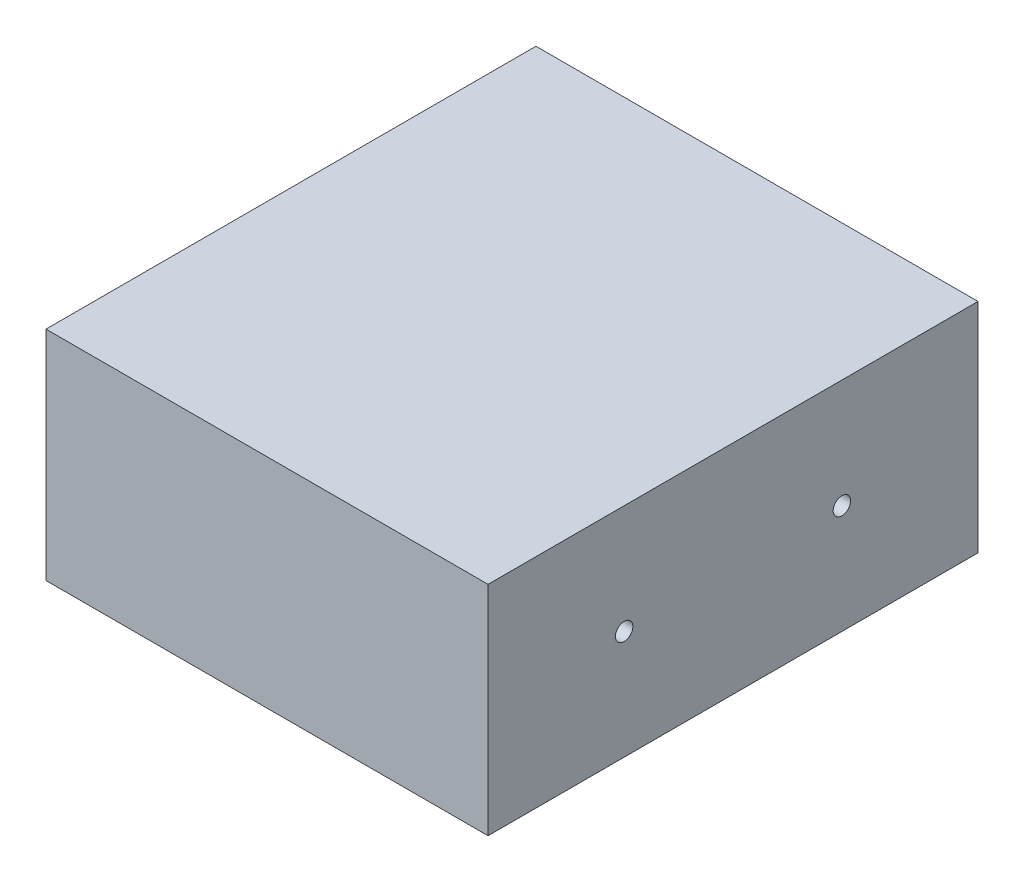
ISO-10303-21;
HEADER;
FILE_DESCRIPTION(('STEP AP214'),'2;1');
FILE_NAME('part.step','',(''),(''),'','','');
FILE_SCHEMA(('AUTOMOTIVE_DESIGN { 1 0 10303 214 1 1 1 1 }'));
ENDSEC;
DATA;
#1=APPLICATION_CONTEXT('core data for automotive mechanical design processes');
#2=APPLICATION_PROTOCOL_DEFINITION('international standard','automotive_design',2000,#1);
#3=PRODUCT_CONTEXT('',#1,'mechanical');
#4=PRODUCT('Part','Part','',(#3));
#5=PRODUCT_RELATED_PRODUCT_CATEGORY('part','',(#4));
#6=PRODUCT_DEFINITION_FORMATION('','',#4);
#7=PRODUCT_DEFINITION_CONTEXT('part definition',#1,'design');
#8=PRODUCT_DEFINITION('design','',#6,#7);
#9=PRODUCT_DEFINITION_SHAPE('','',#8);
#10=(LENGTH_UNIT() NAMED_UNIT(*) SI_UNIT(.MILLI.,.METRE.));
#11=(NAMED_UNIT(*) PLANE_ANGLE_UNIT() SI_UNIT($,.RADIAN.));
#12=(NAMED_UNIT(*) SI_UNIT($,.STERADIAN.) SOLID_ANGLE_UNIT());
#13=UNCERTAINTY_MEASURE_WITH_UNIT(LENGTH_MEASURE(1.E-05),#10,'distance_accuracy_value','');
#14=(GEOMETRIC_REPRESENTATION_CONTEXT(3) GLOBAL_UNCERTAINTY_ASSIGNED_CONTEXT((#13)) GLOBAL_UNIT_ASSIGNED_CONTEXT((#10,
#11,#12)) REPRESENTATION_CONTEXT('',''));
#15=CARTESIAN_POINT('',(0.,0.,0.));
#16=DIRECTION('',(0.,0.,1.));
#17=DIRECTION('',(1.,0.,0.));
#18=AXIS2_PLACEMENT_3D('',#15,#16,#17);
#19=CARTESIAN_POINT('',(20.3,20.,22.5));
#20=DIRECTION('',(-1.,0.,0.));
#21=DIRECTION('',(0.,0.,1.));
#22=AXIS2_PLACEMENT_3D('',#19,#20,#21);
#23=PLANE('',#22);
#24=CARTESIAN_POINT('',(20.3,10.,10.));
#25=DIRECTION('',(1.,0.,0.));
#26=DIRECTION('',(0.,0.,-1.));
#27=AXIS2_PLACEMENT_3D('',#24,#25,#26);
#28=CIRCLE('',#27,0.79999999999999);
#29=CARTESIAN_POINT('',(20.3,10.,9.20000000000001));
#30=VERTEX_POINT('',#29);
#31=EDGE_CURVE('E115',#30,#30,#28,.T.);
#32=ORIENTED_EDGE('',*,*,#31,.F.);
#33=EDGE_LOOP('',(#32));
#34=FACE_BOUND('',#33,.T.);
#35=CARTESIAN_POINT('',(20.3,10.,-10.));
#36=DIRECTION('',(1.,0.,0.));
#37=DIRECTION('',(0.,0.,-1.));
#38=AXIS2_PLACEMENT_3D('',#35,#36,#37);
#39=CIRCLE('',#38,0.79999999999999);
#40=CARTESIAN_POINT('',(20.3,10.,-10.8));
#41=VERTEX_POINT('',#40);
#42=EDGE_CURVE('E121',#41,#41,#39,.T.);
#43=ORIENTED_EDGE('',*,*,#42,.F.);
#44=EDGE_LOOP('',(#43));
#45=FACE_BOUND('',#44,.T.);
#46=DIRECTION('',(0.,0.,-1.));
#47=VECTOR('',#46,1.);
#48=CARTESIAN_POINT('',(20.3,0.,22.5));
#49=LINE('',#48,#47);
#50=CARTESIAN_POINT('',(20.3,0.,22.5));
#51=VERTEX_POINT('',#50);
#52=CARTESIAN_POINT('',(20.3,0.,-22.5));
#53=VERTEX_POINT('',#52);
#54=EDGE_CURVE('E127',#51,#53,#49,.T.);
#55=ORIENTED_EDGE('',*,*,#54,.T.);
#56=DIRECTION('',(0.,-1.,0.));
#57=VECTOR('',#56,1.);
#58=CARTESIAN_POINT('',(20.3,20.,-22.5));
#59=LINE('',#58,#57);
#60=CARTESIAN_POINT('',(20.3,20.,-22.5));
#61=VERTEX_POINT('',#60);
#62=EDGE_CURVE('E11',#61,#53,#59,.T.);
#63=ORIENTED_EDGE('',*,*,#62,.F.);
#64=DIRECTION('',(0.,0.,-1.));
#65=VECTOR('',#64,1.);
#66=CARTESIAN_POINT('',(20.3,20.,22.5));
#67=LINE('',#66,#65);
#68=CARTESIAN_POINT('',(20.3,20.,22.5));
#69=VERTEX_POINT('',#68);
#70=EDGE_CURVE('E128',#69,#61,#67,.T.);
#71=ORIENTED_EDGE('',*,*,#70,.F.);
#72=DIRECTION('',(0.,-1.,0.));
#73=VECTOR('',#72,1.);
#74=CARTESIAN_POINT('',(20.3,20.,22.5));
#75=LINE('',#74,#73);
#76=EDGE_CURVE('E134',#69,#51,#75,.T.);
#77=ORIENTED_EDGE('',*,*,#76,.T.);
#78=EDGE_LOOP('',(#55,#63,#71,#77));
#79=FACE_BOUND('',#78,.T.);
#80=ADVANCED_FACE('F34',(#34,#45,#79),#23,.F.);
#81=CARTESIAN_POINT('',(-20.3,20.,-22.5));
#82=DIRECTION('',(0.,0.,1.));
#83=DIRECTION('',(1.,0.,0.));
#84=AXIS2_PLACEMENT_3D('',#81,#82,#83);
#85=PLANE('',#84);
#86=DIRECTION('',(-1.,0.,0.));
#87=VECTOR('',#86,1.);
#88=CARTESIAN_POINT('',(-20.3,0.,-22.5));
#89=LINE('',#88,#87);
#90=CARTESIAN_POINT('',(-20.3,0.,-22.5));
#91=VERTEX_POINT('',#90);
#92=EDGE_CURVE('E137',#53,#91,#89,.T.);
#93=ORIENTED_EDGE('',*,*,#92,.T.);
#94=DIRECTION('',(0.,-1.,0.));
#95=VECTOR('',#94,1.);
#96=CARTESIAN_POINT('',(-20.3,20.,-22.5));
#97=LINE('',#96,#95);
#98=CARTESIAN_POINT('',(-20.3,20.,-22.5));
#99=VERTEX_POINT('',#98);
#100=EDGE_CURVE('E42',#99,#91,#97,.T.);
#101=ORIENTED_EDGE('',*,*,#100,.F.);
#102=DIRECTION('',(-1.,0.,0.));
#103=VECTOR('',#102,1.);
#104=CARTESIAN_POINT('',(-20.3,20.,-22.5));
#105=LINE('',#104,#103);
#106=EDGE_CURVE('E81',#61,#99,#105,.T.);
#107=ORIENTED_EDGE('',*,*,#106,.F.);
#108=ORIENTED_EDGE('',*,*,#62,.T.);
#109=EDGE_LOOP('',(#93,#101,#107,#108));
#110=FACE_BOUND('',#109,.T.);
#111=ADVANCED_FACE('F160',(#110),#85,.F.);
#112=CARTESIAN_POINT('',(-20.3,20.,22.5));
#113=DIRECTION('',(1.,0.,0.));
#114=DIRECTION('',(0.,0.,-1.));
#115=AXIS2_PLACEMENT_3D('',#112,#113,#114);
#116=PLANE('',#115);
#117=CARTESIAN_POINT('',(-20.3,10.,10.));
#118=DIRECTION('',(-1.,0.,0.));
#119=DIRECTION('',(0.,0.,1.));
#120=AXIS2_PLACEMENT_3D('',#117,#118,#119);
#121=CIRCLE('',#120,0.79999999999999);
#122=CARTESIAN_POINT('',(-20.3,10.,10.8));
#123=VERTEX_POINT('',#122);
#124=EDGE_CURVE('E105',#123,#123,#121,.T.);
#125=ORIENTED_EDGE('',*,*,#124,.F.);
#126=EDGE_LOOP('',(#125));
#127=FACE_BOUND('',#126,.T.);
#128=CARTESIAN_POINT('',(-20.3,10.,-10.));
#129=DIRECTION('',(-1.,0.,0.));
#130=DIRECTION('',(0.,0.,1.));
#131=AXIS2_PLACEMENT_3D('',#128,#129,#130);
#132=CIRCLE('',#131,0.79999999999999);
#133=CARTESIAN_POINT('',(-20.3,10.,-9.20000000000001));
#134=VERTEX_POINT('',#133);
#135=EDGE_CURVE('E104',#134,#134,#132,.T.);
#136=ORIENTED_EDGE('',*,*,#135,.F.);
#137=EDGE_LOOP('',(#136));
#138=FACE_BOUND('',#137,.T.);
#139=DIRECTION('',(0.,0.,1.));
#140=VECTOR('',#139,1.);
#141=CARTESIAN_POINT('',(-20.3,0.,22.5));
#142=LINE('',#141,#140);
#143=CARTESIAN_POINT('',(-20.3,0.,22.5));
#144=VERTEX_POINT('',#143);
#145=EDGE_CURVE('E68',#91,#144,#142,.T.);
#146=ORIENTED_EDGE('',*,*,#145,.T.);
#147=DIRECTION('',(0.,-1.,0.));
#148=VECTOR('',#147,1.);
#149=CARTESIAN_POINT('',(-20.3,20.,22.5));
#150=LINE('',#149,#148);
#151=CARTESIAN_POINT('',(-20.3,20.,22.5));
#152=VERTEX_POINT('',#151);
#153=EDGE_CURVE('E142',#152,#144,#150,.T.);
#154=ORIENTED_EDGE('',*,*,#153,.F.);
#155=DIRECTION('',(0.,0.,1.));
#156=VECTOR('',#155,1.);
#157=CARTESIAN_POINT('',(-20.3,20.,22.5));
#158=LINE('',#157,#156);
#159=EDGE_CURVE('E131',#99,#152,#158,.T.);
#160=ORIENTED_EDGE('',*,*,#159,.F.);
#161=ORIENTED_EDGE('',*,*,#100,.T.);
#162=EDGE_LOOP('',(#146,#154,#160,#161));
#163=FACE_BOUND('',#162,.T.);
#164=ADVANCED_FACE('F144',(#127,#138,#163),#116,.F.);
#165=CARTESIAN_POINT('',(-20.3,20.,22.5));
#166=DIRECTION('',(0.,0.,-1.));
#167=DIRECTION('',(-1.,0.,0.));
#168=AXIS2_PLACEMENT_3D('',#165,#166,#167);
#169=PLANE('',#168);
#170=DIRECTION('',(1.,0.,0.));
#171=VECTOR('',#170,1.);
#172=CARTESIAN_POINT('',(-20.3,0.,22.5));
#173=LINE('',#172,#171);
#174=EDGE_CURVE('E74',#144,#51,#173,.T.);
#175=ORIENTED_EDGE('',*,*,#174,.T.);
#176=ORIENTED_EDGE('',*,*,#76,.F.);
#177=DIRECTION('',(1.,0.,0.));
#178=VECTOR('',#177,1.);
#179=CARTESIAN_POINT('',(-20.3,20.,22.5));
#180=LINE('',#179,#178);
#181=EDGE_CURVE('E50',#152,#69,#180,.T.);
#182=ORIENTED_EDGE('',*,*,#181,.F.);
#183=ORIENTED_EDGE('',*,*,#153,.T.);
#184=EDGE_LOOP('',(#175,#176,#182,#183));
#185=FACE_BOUND('',#184,.T.);
#186=ADVANCED_FACE('F151',(#185),#169,.F.);
#187=CARTESIAN_POINT('',(0.,20.,0.));
#188=DIRECTION('',(0.,-1.,0.));
#189=DIRECTION('',(0.,0.,-1.));
#190=AXIS2_PLACEMENT_3D('',#187,#188,#189);
#191=PLANE('',#190);
#192=ORIENTED_EDGE('',*,*,#70,.T.);
#193=ORIENTED_EDGE('',*,*,#106,.T.);
#194=ORIENTED_EDGE('',*,*,#159,.T.);
#195=ORIENTED_EDGE('',*,*,#181,.T.);
#196=EDGE_LOOP('',(#192,#193,#194,#195));
#197=FACE_BOUND('',#196,.T.);
#198=ADVANCED_FACE('F153',(#197),#191,.F.);
#199=CARTESIAN_POINT('',(0.,0.,0.));
#200=DIRECTION('',(0.,-1.,0.));
#201=DIRECTION('',(0.,0.,-1.));
#202=AXIS2_PLACEMENT_3D('',#199,#200,#201);
#203=PLANE('',#202);
#204=ORIENTED_EDGE('',*,*,#54,.F.);
#205=ORIENTED_EDGE('',*,*,#174,.F.);
#206=ORIENTED_EDGE('',*,*,#145,.F.);
#207=ORIENTED_EDGE('',*,*,#92,.F.);
#208=EDGE_LOOP('',(#204,#205,#206,#207));
#209=FACE_BOUND('',#208,.T.);
#210=ADVANCED_FACE('F147',(#209),#203,.T.);
#211=CARTESIAN_POINT('',(12.3,10.,-10.));
#212=DIRECTION('',(1.,0.,0.));
#213=DIRECTION('',(0.,0.,-1.));
#214=AXIS2_PLACEMENT_3D('',#211,#212,#213);
#215=CONICAL_SURFACE('',#214,0.799999999999988,1.02974425867665);
#216=CARTESIAN_POINT('',(11.819311504778,10.,-10.));
#217=VERTEX_POINT('',#216);
#218=VERTEX_LOOP('',#217);
#219=FACE_BOUND('',#218,.T.);
#220=CARTESIAN_POINT('',(12.3,10.,-10.));
#221=DIRECTION('',(1.,0.,0.));
#222=DIRECTION('',(0.,0.,-1.));
#223=AXIS2_PLACEMENT_3D('',#220,#221,#222);
#224=CIRCLE('',#223,0.799999999999988);
#225=CARTESIAN_POINT('',(12.3,10.,-10.8));
#226=VERTEX_POINT('',#225);
#227=EDGE_CURVE('E124',#226,#226,#224,.T.);
#228=ORIENTED_EDGE('',*,*,#227,.T.);
#229=EDGE_LOOP('',(#228));
#230=FACE_BOUND('',#229,.T.);
#231=ADVANCED_FACE('F176',(#219,#230),#215,.F.);
#232=CARTESIAN_POINT('',(20.3,10.,-10.));
#233=DIRECTION('',(1.,0.,0.));
#234=DIRECTION('',(0.,0.,-1.));
#235=AXIS2_PLACEMENT_3D('',#232,#233,#234);
#236=CYLINDRICAL_SURFACE('',#235,0.799999999999989);
#237=ORIENTED_EDGE('',*,*,#227,.F.);
#238=EDGE_LOOP('',(#237));
#239=FACE_BOUND('',#238,.T.);
#240=ORIENTED_EDGE('',*,*,#42,.T.);
#241=EDGE_LOOP('',(#240));
#242=FACE_BOUND('',#241,.T.);
#243=ADVANCED_FACE('F173',(#239,#242),#236,.F.);
#244=CARTESIAN_POINT('',(12.3,10.,10.));
#245=DIRECTION('',(1.,0.,0.));
#246=DIRECTION('',(0.,0.,-1.));
#247=AXIS2_PLACEMENT_3D('',#244,#245,#246);
#248=CONICAL_SURFACE('',#247,0.799999999999988,1.02974425867665);
#249=CARTESIAN_POINT('',(11.819311504778,10.,10.));
#250=VERTEX_POINT('',#249);
#251=VERTEX_LOOP('',#250);
#252=FACE_BOUND('',#251,.T.);
#253=CARTESIAN_POINT('',(12.3,10.,10.));
#254=DIRECTION('',(1.,0.,0.));
#255=DIRECTION('',(0.,0.,-1.));
#256=AXIS2_PLACEMENT_3D('',#253,#254,#255);
#257=CIRCLE('',#256,0.799999999999988);
#258=CARTESIAN_POINT('',(12.3,10.,9.20000000000001));
#259=VERTEX_POINT('',#258);
#260=EDGE_CURVE('E118',#259,#259,#257,.T.);
#261=ORIENTED_EDGE('',*,*,#260,.T.);
#262=EDGE_LOOP('',(#261));
#263=FACE_BOUND('',#262,.T.);
#264=ADVANCED_FACE('F175',(#252,#263),#248,.F.);
#265=CARTESIAN_POINT('',(20.3,10.,10.));
#266=DIRECTION('',(1.,0.,0.));
#267=DIRECTION('',(0.,0.,-1.));
#268=AXIS2_PLACEMENT_3D('',#265,#266,#267);
#269=CYLINDRICAL_SURFACE('',#268,0.799999999999989);
#270=ORIENTED_EDGE('',*,*,#260,.F.);
#271=EDGE_LOOP('',(#270));
#272=FACE_BOUND('',#271,.T.);
#273=ORIENTED_EDGE('',*,*,#31,.T.);
#274=EDGE_LOOP('',(#273));
#275=FACE_BOUND('',#274,.T.);
#276=ADVANCED_FACE('F183',(#272,#275),#269,.F.);
#277=CARTESIAN_POINT('',(-12.3,10.,-10.));
#278=DIRECTION('',(-1.,0.,0.));
#279=DIRECTION('',(0.,0.,1.));
#280=AXIS2_PLACEMENT_3D('',#277,#278,#279);
#281=CONICAL_SURFACE('',#280,0.799999999999988,1.02974425867665);
#282=CARTESIAN_POINT('',(-11.819311504778,10.,-10.));
#283=VERTEX_POINT('',#282);
#284=VERTEX_LOOP('',#283);
#285=FACE_BOUND('',#284,.T.);
#286=CARTESIAN_POINT('',(-12.3,10.,-10.));
#287=DIRECTION('',(-1.,0.,0.));
#288=DIRECTION('',(0.,0.,1.));
#289=AXIS2_PLACEMENT_3D('',#286,#287,#288);
#290=CIRCLE('',#289,0.799999999999988);
#291=CARTESIAN_POINT('',(-12.3,10.,-9.20000000000001));
#292=VERTEX_POINT('',#291);
#293=EDGE_CURVE('E108',#292,#292,#290,.T.);
#294=ORIENTED_EDGE('',*,*,#293,.T.);
#295=EDGE_LOOP('',(#294));
#296=FACE_BOUND('',#295,.T.);
#297=ADVANCED_FACE('F220',(#285,#296),#281,.F.);
#298=CARTESIAN_POINT('',(-20.3,10.,-10.));
#299=DIRECTION('',(-1.,0.,0.));
#300=DIRECTION('',(0.,0.,1.));
#301=AXIS2_PLACEMENT_3D('',#298,#299,#300);
#302=CYLINDRICAL_SURFACE('',#301,0.799999999999989);
#303=ORIENTED_EDGE('',*,*,#293,.F.);
#304=EDGE_LOOP('',(#303));
#305=FACE_BOUND('',#304,.T.);
#306=ORIENTED_EDGE('',*,*,#135,.T.);
#307=EDGE_LOOP('',(#306));
#308=FACE_BOUND('',#307,.T.);
#309=ADVANCED_FACE('F98',(#305,#308),#302,.F.);
#310=CARTESIAN_POINT('',(-12.3,10.,10.));
#311=DIRECTION('',(-1.,0.,0.));
#312=DIRECTION('',(0.,0.,1.));
#313=AXIS2_PLACEMENT_3D('',#310,#311,#312);
#314=CONICAL_SURFACE('',#313,0.799999999999988,1.02974425867665);
#315=CARTESIAN_POINT('',(-11.819311504778,10.,10.));
#316=VERTEX_POINT('',#315);
#317=VERTEX_LOOP('',#316);
#318=FACE_BOUND('',#317,.T.);
#319=CARTESIAN_POINT('',(-12.3,10.,10.));
#320=DIRECTION('',(-1.,0.,0.));
#321=DIRECTION('',(0.,0.,1.));
#322=AXIS2_PLACEMENT_3D('',#319,#320,#321);
#323=CIRCLE('',#322,0.799999999999988);
#324=CARTESIAN_POINT('',(-12.3,10.,10.8));
#325=VERTEX_POINT('',#324);
#326=EDGE_CURVE('E102',#325,#325,#323,.T.);
#327=ORIENTED_EDGE('',*,*,#326,.T.);
#328=EDGE_LOOP('',(#327));
#329=FACE_BOUND('',#328,.T.);
#330=ADVANCED_FACE('F94',(#318,#329),#314,.F.);
#331=CARTESIAN_POINT('',(-20.3,10.,10.));
#332=DIRECTION('',(-1.,0.,0.));
#333=DIRECTION('',(0.,0.,1.));
#334=AXIS2_PLACEMENT_3D('',#331,#332,#333);
#335=CYLINDRICAL_SURFACE('',#334,0.799999999999989);
#336=ORIENTED_EDGE('',*,*,#326,.F.);
#337=EDGE_LOOP('',(#336));
#338=FACE_BOUND('',#337,.T.);
#339=ORIENTED_EDGE('',*,*,#124,.T.);
#340=EDGE_LOOP('',(#339));
#341=FACE_BOUND('',#340,.T.);
#342=ADVANCED_FACE('F97',(#338,#341),#335,.F.);
#343=CLOSED_SHELL('',(#80,#111,#164,#186,#198,#210,#231,#243,#264,#276,#297,#309,#330,#342));
#344=MANIFOLD_SOLID_BREP('B2',#343);
#345=ADVANCED_BREP_SHAPE_REPRESENTATION('',(#18,#344),#14);
#346=SHAPE_DEFINITION_REPRESENTATION(#9,#345);
ENDSEC;
END-ISO-10303-21;
